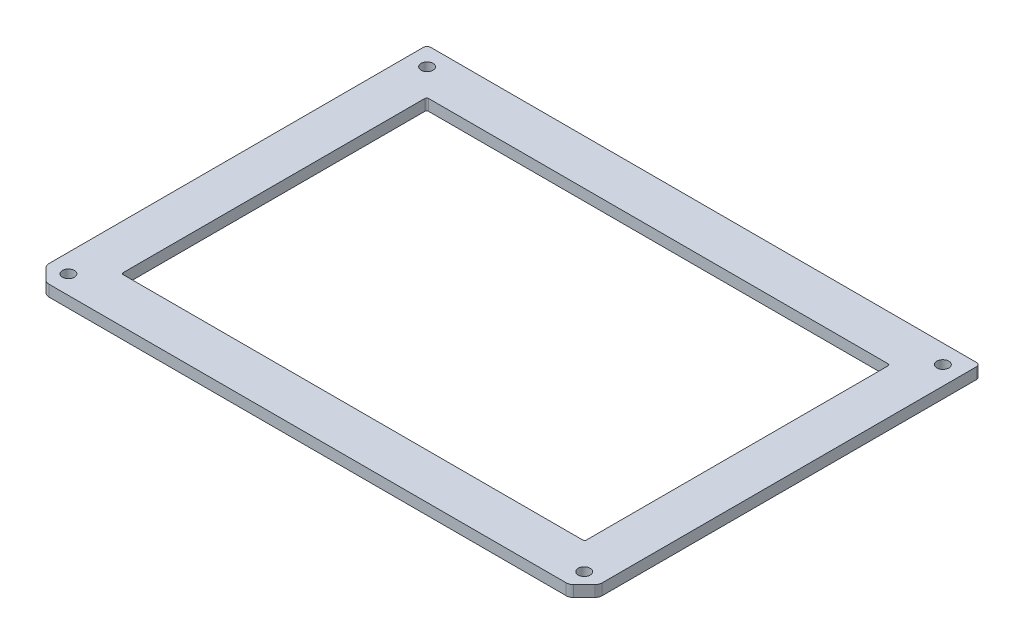
ISO-10303-21;
HEADER;
FILE_DESCRIPTION(('STEP AP214'),'2;1');
FILE_NAME('part.step','',(''),(''),'','','');
FILE_SCHEMA(('AUTOMOTIVE_DESIGN { 1 0 10303 214 1 1 1 1 }'));
ENDSEC;
DATA;
#1=APPLICATION_CONTEXT('core data for automotive mechanical design processes');
#2=APPLICATION_PROTOCOL_DEFINITION('international standard','automotive_design',2000,#1);
#3=PRODUCT_CONTEXT('',#1,'mechanical');
#4=PRODUCT('Part','Part','',(#3));
#5=PRODUCT_RELATED_PRODUCT_CATEGORY('part','',(#4));
#6=PRODUCT_DEFINITION_FORMATION('','',#4);
#7=PRODUCT_DEFINITION_CONTEXT('part definition',#1,'design');
#8=PRODUCT_DEFINITION('design','',#6,#7);
#9=PRODUCT_DEFINITION_SHAPE('','',#8);
#10=(LENGTH_UNIT() NAMED_UNIT(*) SI_UNIT(.MILLI.,.METRE.));
#11=(NAMED_UNIT(*) PLANE_ANGLE_UNIT() SI_UNIT($,.RADIAN.));
#12=(NAMED_UNIT(*) SI_UNIT($,.STERADIAN.) SOLID_ANGLE_UNIT());
#13=UNCERTAINTY_MEASURE_WITH_UNIT(LENGTH_MEASURE(1.E-05),#10,'distance_accuracy_value','');
#14=(GEOMETRIC_REPRESENTATION_CONTEXT(3) GLOBAL_UNCERTAINTY_ASSIGNED_CONTEXT((#13)) GLOBAL_UNIT_ASSIGNED_CONTEXT((#10,
#11,#12)) REPRESENTATION_CONTEXT('',''));
#15=CARTESIAN_POINT('',(0.,0.,0.));
#16=DIRECTION('',(0.,0.,1.));
#17=DIRECTION('',(1.,0.,0.));
#18=AXIS2_PLACEMENT_3D('',#15,#16,#17);
#19=CARTESIAN_POINT('',(0.,3.,0.));
#20=DIRECTION('',(0.,1.,0.));
#21=DIRECTION('',(0.,0.,1.));
#22=AXIS2_PLACEMENT_3D('',#19,#20,#21);
#23=PLANE('',#22);
#24=DIRECTION('',(-0.707106781186552,0.,0.707106781186543));
#25=VECTOR('',#24,1.);
#26=CARTESIAN_POINT('',(77.1,3.,46.05));
#27=LINE('',#26,#25);
#28=CARTESIAN_POINT('',(73.5142135623731,3.,49.6357864376269));
#29=VERTEX_POINT('',#28);
#30=CARTESIAN_POINT('',(70.6857864376268,3.,52.4642135623731));
#31=VERTEX_POINT('',#30);
#32=EDGE_CURVE('E298',#29,#31,#27,.T.);
#33=ORIENTED_EDGE('',*,*,#32,.F.);
#34=CARTESIAN_POINT('',(72.1,3.,48.2215728752538));
#35=DIRECTION('',(0.,1.,0.));
#36=DIRECTION('',(0.,0.,1.));
#37=AXIS2_PLACEMENT_3D('',#34,#35,#36);
#38=CIRCLE('',#37,2.);
#39=CARTESIAN_POINT('',(74.1,3.,48.2215728752538));
#40=VERTEX_POINT('',#39);
#41=EDGE_CURVE('E261',#29,#40,#38,.T.);
#42=ORIENTED_EDGE('',*,*,#41,.T.);
#43=DIRECTION('',(0.,0.,-1.));
#44=VECTOR('',#43,1.);
#45=CARTESIAN_POINT('',(74.1,3.,-53.05));
#46=LINE('',#45,#44);
#47=CARTESIAN_POINT('',(74.1,3.,-52.05));
#48=VERTEX_POINT('',#47);
#49=EDGE_CURVE('E200',#40,#48,#46,.T.);
#50=ORIENTED_EDGE('',*,*,#49,.T.);
#51=CARTESIAN_POINT('',(73.1,3.,-52.05));
#52=DIRECTION('',(0.,1.,0.));
#53=DIRECTION('',(0.,0.,1.));
#54=AXIS2_PLACEMENT_3D('',#51,#52,#53);
#55=CIRCLE('',#54,1.);
#56=CARTESIAN_POINT('',(73.1,3.,-53.05));
#57=VERTEX_POINT('',#56);
#58=EDGE_CURVE('E195',#48,#57,#55,.T.);
#59=ORIENTED_EDGE('',*,*,#58,.T.);
#60=DIRECTION('',(-1.,0.,0.));
#61=VECTOR('',#60,1.);
#62=CARTESIAN_POINT('',(-74.1,3.,-53.05));
#63=LINE('',#62,#61);
#64=CARTESIAN_POINT('',(-73.1,3.,-53.05));
#65=VERTEX_POINT('',#64);
#66=EDGE_CURVE('E196',#57,#65,#63,.T.);
#67=ORIENTED_EDGE('',*,*,#66,.T.);
#68=CARTESIAN_POINT('',(-73.1,3.,-52.05));
#69=DIRECTION('',(0.,1.,0.));
#70=DIRECTION('',(0.,0.,1.));
#71=AXIS2_PLACEMENT_3D('',#68,#69,#70);
#72=CIRCLE('',#71,1.);
#73=CARTESIAN_POINT('',(-74.1,3.,-52.05));
#74=VERTEX_POINT('',#73);
#75=EDGE_CURVE('E191',#65,#74,#72,.T.);
#76=ORIENTED_EDGE('',*,*,#75,.T.);
#77=DIRECTION('',(0.,0.,1.));
#78=VECTOR('',#77,1.);
#79=CARTESIAN_POINT('',(-74.1,3.,-53.05));
#80=LINE('',#79,#78);
#81=CARTESIAN_POINT('',(-74.1,3.,48.2215728752538));
#82=VERTEX_POINT('',#81);
#83=EDGE_CURVE('E350',#74,#82,#80,.T.);
#84=ORIENTED_EDGE('',*,*,#83,.T.);
#85=CARTESIAN_POINT('',(-72.1,3.,48.2215728752538));
#86=DIRECTION('',(0.,1.,0.));
#87=DIRECTION('',(0.,0.,1.));
#88=AXIS2_PLACEMENT_3D('',#85,#86,#87);
#89=CIRCLE('',#88,2.);
#90=CARTESIAN_POINT('',(-73.5142135623731,3.,49.6357864376269));
#91=VERTEX_POINT('',#90);
#92=EDGE_CURVE('E255',#82,#91,#89,.T.);
#93=ORIENTED_EDGE('',*,*,#92,.T.);
#94=DIRECTION('',(-0.707106781186551,0.,-0.707106781186544));
#95=VECTOR('',#94,1.);
#96=CARTESIAN_POINT('',(-77.1,3.,46.05));
#97=LINE('',#96,#95);
#98=CARTESIAN_POINT('',(-70.6857864376268,3.,52.4642135623731));
#99=VERTEX_POINT('',#98);
#100=EDGE_CURVE('E282',#99,#91,#97,.T.);
#101=ORIENTED_EDGE('',*,*,#100,.F.);
#102=CARTESIAN_POINT('',(-69.2715728752538,3.,51.05));
#103=DIRECTION('',(0.,1.,0.));
#104=DIRECTION('',(0.,0.,1.));
#105=AXIS2_PLACEMENT_3D('',#102,#103,#104);
#106=CIRCLE('',#105,2.);
#107=CARTESIAN_POINT('',(-69.2715728752538,3.,53.05));
#108=VERTEX_POINT('',#107);
#109=EDGE_CURVE('E257',#99,#108,#106,.T.);
#110=ORIENTED_EDGE('',*,*,#109,.T.);
#111=DIRECTION('',(1.,0.,0.));
#112=VECTOR('',#111,1.);
#113=CARTESIAN_POINT('',(-74.1,3.,53.05));
#114=LINE('',#113,#112);
#115=CARTESIAN_POINT('',(69.2715728752537,3.,53.05));
#116=VERTEX_POINT('',#115);
#117=EDGE_CURVE('E352',#108,#116,#114,.T.);
#118=ORIENTED_EDGE('',*,*,#117,.T.);
#119=CARTESIAN_POINT('',(69.2715728752537,3.,51.05));
#120=DIRECTION('',(0.,1.,0.));
#121=DIRECTION('',(0.,0.,1.));
#122=AXIS2_PLACEMENT_3D('',#119,#120,#121);
#123=CIRCLE('',#122,2.);
#124=EDGE_CURVE('E259',#116,#31,#123,.T.);
#125=ORIENTED_EDGE('',*,*,#124,.T.);
#126=EDGE_LOOP('',(#33,#42,#50,#59,#67,#76,#84,#93,#101,#110,#118,#125));
#127=FACE_BOUND('',#126,.T.);
#128=CARTESIAN_POINT('',(69.1,3.,48.05));
#129=DIRECTION('',(0.,1.,0.));
#130=DIRECTION('',(0.,0.,1.));
#131=AXIS2_PLACEMENT_3D('',#128,#129,#130);
#132=CIRCLE('',#131,1.60000000000001);
#133=CARTESIAN_POINT('',(69.1,3.,49.65));
#134=VERTEX_POINT('',#133);
#135=EDGE_CURVE('E308',#134,#134,#132,.T.);
#136=ORIENTED_EDGE('',*,*,#135,.F.);
#137=EDGE_LOOP('',(#136));
#138=FACE_BOUND('',#137,.T.);
#139=CARTESIAN_POINT('',(-69.1,3.,-48.05));
#140=DIRECTION('',(0.,1.,0.));
#141=DIRECTION('',(0.,0.,1.));
#142=AXIS2_PLACEMENT_3D('',#139,#140,#141);
#143=CIRCLE('',#142,1.60000000000001);
#144=CARTESIAN_POINT('',(-69.1,3.,-46.45));
#145=VERTEX_POINT('',#144);
#146=EDGE_CURVE('E320',#145,#145,#143,.T.);
#147=ORIENTED_EDGE('',*,*,#146,.F.);
#148=EDGE_LOOP('',(#147));
#149=FACE_BOUND('',#148,.T.);
#150=DIRECTION('',(-1.,0.,0.));
#151=VECTOR('',#150,1.);
#152=CARTESIAN_POINT('',(-62.05,3.,-40.9));
#153=LINE('',#152,#151);
#154=CARTESIAN_POINT('',(61.55,3.,-40.9));
#155=VERTEX_POINT('',#154);
#156=CARTESIAN_POINT('',(-61.55,3.,-40.9));
#157=VERTEX_POINT('',#156);
#158=EDGE_CURVE('E329',#155,#157,#153,.T.);
#159=ORIENTED_EDGE('',*,*,#158,.F.);
#160=CARTESIAN_POINT('',(61.55,3.,-40.4));
#161=DIRECTION('',(0.,1.,0.));
#162=DIRECTION('',(0.,0.,1.));
#163=AXIS2_PLACEMENT_3D('',#160,#161,#162);
#164=CIRCLE('',#163,0.5);
#165=CARTESIAN_POINT('',(62.05,3.,-40.4));
#166=VERTEX_POINT('',#165);
#167=EDGE_CURVE('E239',#155,#166,#164,.F.);
#168=ORIENTED_EDGE('',*,*,#167,.T.);
#169=DIRECTION('',(0.,0.,-1.));
#170=VECTOR('',#169,1.);
#171=CARTESIAN_POINT('',(62.05,3.,-40.9));
#172=LINE('',#171,#170);
#173=CARTESIAN_POINT('',(62.05,3.,40.4));
#174=VERTEX_POINT('',#173);
#175=EDGE_CURVE('E326',#174,#166,#172,.T.);
#176=ORIENTED_EDGE('',*,*,#175,.F.);
#177=CARTESIAN_POINT('',(61.55,3.,40.4));
#178=DIRECTION('',(0.,1.,0.));
#179=DIRECTION('',(0.,0.,1.));
#180=AXIS2_PLACEMENT_3D('',#177,#178,#179);
#181=CIRCLE('',#180,0.5);
#182=CARTESIAN_POINT('',(61.55,3.,40.9));
#183=VERTEX_POINT('',#182);
#184=EDGE_CURVE('E235',#174,#183,#181,.F.);
#185=ORIENTED_EDGE('',*,*,#184,.T.);
#186=DIRECTION('',(1.,0.,0.));
#187=VECTOR('',#186,1.);
#188=CARTESIAN_POINT('',(-62.05,3.,40.9));
#189=LINE('',#188,#187);
#190=CARTESIAN_POINT('',(-61.55,3.,40.9));
#191=VERTEX_POINT('',#190);
#192=EDGE_CURVE('E336',#191,#183,#189,.T.);
#193=ORIENTED_EDGE('',*,*,#192,.F.);
#194=CARTESIAN_POINT('',(-61.55,3.,40.4));
#195=DIRECTION('',(0.,1.,0.));
#196=DIRECTION('',(0.,0.,1.));
#197=AXIS2_PLACEMENT_3D('',#194,#195,#196);
#198=CIRCLE('',#197,0.5);
#199=CARTESIAN_POINT('',(-62.05,3.,40.4));
#200=VERTEX_POINT('',#199);
#201=EDGE_CURVE('E247',#191,#200,#198,.F.);
#202=ORIENTED_EDGE('',*,*,#201,.T.);
#203=DIRECTION('',(0.,0.,1.));
#204=VECTOR('',#203,1.);
#205=CARTESIAN_POINT('',(-62.05,3.,-40.9));
#206=LINE('',#205,#204);
#207=CARTESIAN_POINT('',(-62.05,3.,-40.4));
#208=VERTEX_POINT('',#207);
#209=EDGE_CURVE('E333',#208,#200,#206,.T.);
#210=ORIENTED_EDGE('',*,*,#209,.F.);
#211=CARTESIAN_POINT('',(-61.55,3.,-40.4));
#212=DIRECTION('',(0.,1.,0.));
#213=DIRECTION('',(0.,0.,1.));
#214=AXIS2_PLACEMENT_3D('',#211,#212,#213);
#215=CIRCLE('',#214,0.5);
#216=EDGE_CURVE('E243',#208,#157,#215,.F.);
#217=ORIENTED_EDGE('',*,*,#216,.T.);
#218=EDGE_LOOP('',(#159,#168,#176,#185,#193,#202,#210,#217));
#219=FACE_BOUND('',#218,.T.);
#220=CARTESIAN_POINT('',(-69.1,3.,48.05));
#221=DIRECTION('',(0.,1.,0.));
#222=DIRECTION('',(0.,0.,-1.));
#223=AXIS2_PLACEMENT_3D('',#220,#221,#222);
#224=CIRCLE('',#223,1.60000000000001);
#225=CARTESIAN_POINT('',(-69.1,3.,46.45));
#226=VERTEX_POINT('',#225);
#227=EDGE_CURVE('E314',#226,#226,#224,.T.);
#228=ORIENTED_EDGE('',*,*,#227,.F.);
#229=EDGE_LOOP('',(#228));
#230=FACE_BOUND('',#229,.T.);
#231=CARTESIAN_POINT('',(69.1,3.,-48.05));
#232=DIRECTION('',(0.,1.,0.));
#233=DIRECTION('',(0.,0.,-1.));
#234=AXIS2_PLACEMENT_3D('',#231,#232,#233);
#235=CIRCLE('',#234,1.60000000000001);
#236=CARTESIAN_POINT('',(69.1,3.,-49.65));
#237=VERTEX_POINT('',#236);
#238=EDGE_CURVE('E302',#237,#237,#235,.T.);
#239=ORIENTED_EDGE('',*,*,#238,.F.);
#240=EDGE_LOOP('',(#239));
#241=FACE_BOUND('',#240,.T.);
#242=ADVANCED_FACE('F33',(#127,#138,#149,#219,#230,#241),#23,.T.);
#243=CARTESIAN_POINT('',(0.,0.,0.));
#244=DIRECTION('',(0.,1.,0.));
#245=DIRECTION('',(0.,0.,1.));
#246=AXIS2_PLACEMENT_3D('',#243,#244,#245);
#247=PLANE('',#246);
#248=DIRECTION('',(0.,0.,-1.));
#249=VECTOR('',#248,1.);
#250=CARTESIAN_POINT('',(74.1,0.,-53.05));
#251=LINE('',#250,#249);
#252=CARTESIAN_POINT('',(74.1,0.,48.2215728752538));
#253=VERTEX_POINT('',#252);
#254=CARTESIAN_POINT('',(74.1,0.,-52.05));
#255=VERTEX_POINT('',#254);
#256=EDGE_CURVE('E170',#253,#255,#251,.T.);
#257=ORIENTED_EDGE('',*,*,#256,.F.);
#258=CARTESIAN_POINT('',(72.1,0.,48.2215728752538));
#259=DIRECTION('',(0.,1.,0.));
#260=DIRECTION('',(0.,0.,1.));
#261=AXIS2_PLACEMENT_3D('',#258,#259,#260);
#262=CIRCLE('',#261,2.);
#263=CARTESIAN_POINT('',(73.5142135623731,0.,49.6357864376269));
#264=VERTEX_POINT('',#263);
#265=EDGE_CURVE('E268',#253,#264,#262,.F.);
#266=ORIENTED_EDGE('',*,*,#265,.T.);
#267=DIRECTION('',(0.707106781186552,0.,-0.707106781186543));
#268=VECTOR('',#267,1.);
#269=CARTESIAN_POINT('',(77.1,0.,46.05));
#270=LINE('',#269,#268);
#271=CARTESIAN_POINT('',(70.6857864376268,0.,52.4642135623731));
#272=VERTEX_POINT('',#271);
#273=EDGE_CURVE('E293',#272,#264,#270,.T.);
#274=ORIENTED_EDGE('',*,*,#273,.F.);
#275=CARTESIAN_POINT('',(69.2715728752537,0.,51.05));
#276=DIRECTION('',(0.,1.,0.));
#277=DIRECTION('',(0.,0.,1.));
#278=AXIS2_PLACEMENT_3D('',#275,#276,#277);
#279=CIRCLE('',#278,2.);
#280=CARTESIAN_POINT('',(69.2715728752537,0.,53.05));
#281=VERTEX_POINT('',#280);
#282=EDGE_CURVE('E266',#272,#281,#279,.F.);
#283=ORIENTED_EDGE('',*,*,#282,.T.);
#284=DIRECTION('',(1.,0.,0.));
#285=VECTOR('',#284,1.);
#286=CARTESIAN_POINT('',(-74.1,0.,53.05));
#287=LINE('',#286,#285);
#288=CARTESIAN_POINT('',(-69.2715728752538,0.,53.05));
#289=VERTEX_POINT('',#288);
#290=EDGE_CURVE('E181',#289,#281,#287,.T.);
#291=ORIENTED_EDGE('',*,*,#290,.F.);
#292=CARTESIAN_POINT('',(-69.2715728752538,0.,51.05));
#293=DIRECTION('',(0.,1.,0.));
#294=DIRECTION('',(0.,0.,1.));
#295=AXIS2_PLACEMENT_3D('',#292,#293,#294);
#296=CIRCLE('',#295,2.);
#297=CARTESIAN_POINT('',(-70.6857864376268,0.,52.4642135623731));
#298=VERTEX_POINT('',#297);
#299=EDGE_CURVE('E54',#289,#298,#296,.F.);
#300=ORIENTED_EDGE('',*,*,#299,.T.);
#301=DIRECTION('',(0.707106781186551,0.,0.707106781186544));
#302=VECTOR('',#301,1.);
#303=CARTESIAN_POINT('',(-77.1,0.,46.05));
#304=LINE('',#303,#302);
#305=CARTESIAN_POINT('',(-73.5142135623731,0.,49.6357864376269));
#306=VERTEX_POINT('',#305);
#307=EDGE_CURVE('E284',#306,#298,#304,.T.);
#308=ORIENTED_EDGE('',*,*,#307,.F.);
#309=CARTESIAN_POINT('',(-72.1,0.,48.2215728752538));
#310=DIRECTION('',(0.,1.,0.));
#311=DIRECTION('',(0.,0.,1.));
#312=AXIS2_PLACEMENT_3D('',#309,#310,#311);
#313=CIRCLE('',#312,2.);
#314=CARTESIAN_POINT('',(-74.1,0.,48.2215728752538));
#315=VERTEX_POINT('',#314);
#316=EDGE_CURVE('E48',#306,#315,#313,.F.);
#317=ORIENTED_EDGE('',*,*,#316,.T.);
#318=DIRECTION('',(0.,0.,1.));
#319=VECTOR('',#318,1.);
#320=CARTESIAN_POINT('',(-74.1,0.,-53.05));
#321=LINE('',#320,#319);
#322=CARTESIAN_POINT('',(-74.1,0.,-52.05));
#323=VERTEX_POINT('',#322);
#324=EDGE_CURVE('E339',#323,#315,#321,.T.);
#325=ORIENTED_EDGE('',*,*,#324,.F.);
#326=CARTESIAN_POINT('',(-73.1,0.,-52.05));
#327=DIRECTION('',(0.,1.,0.));
#328=DIRECTION('',(0.,0.,1.));
#329=AXIS2_PLACEMENT_3D('',#326,#327,#328);
#330=CIRCLE('',#329,1.);
#331=CARTESIAN_POINT('',(-73.1,0.,-53.05));
#332=VERTEX_POINT('',#331);
#333=EDGE_CURVE('E192',#323,#332,#330,.F.);
#334=ORIENTED_EDGE('',*,*,#333,.T.);
#335=DIRECTION('',(-1.,0.,0.));
#336=VECTOR('',#335,1.);
#337=CARTESIAN_POINT('',(-74.1,0.,-53.05));
#338=LINE('',#337,#336);
#339=CARTESIAN_POINT('',(73.1,0.,-53.05));
#340=VERTEX_POINT('',#339);
#341=EDGE_CURVE('E180',#340,#332,#338,.T.);
#342=ORIENTED_EDGE('',*,*,#341,.F.);
#343=CARTESIAN_POINT('',(73.1,0.,-52.05));
#344=DIRECTION('',(0.,1.,0.));
#345=DIRECTION('',(0.,0.,1.));
#346=AXIS2_PLACEMENT_3D('',#343,#344,#345);
#347=CIRCLE('',#346,1.);
#348=EDGE_CURVE('E184',#340,#255,#347,.F.);
#349=ORIENTED_EDGE('',*,*,#348,.T.);
#350=EDGE_LOOP('',(#257,#266,#274,#283,#291,#300,#308,#317,#325,#334,#342,#349));
#351=FACE_BOUND('',#350,.T.);
#352=DIRECTION('',(1.,0.,0.));
#353=VECTOR('',#352,1.);
#354=CARTESIAN_POINT('',(-62.05,0.,40.9));
#355=LINE('',#354,#353);
#356=CARTESIAN_POINT('',(-61.55,0.,40.9));
#357=VERTEX_POINT('',#356);
#358=CARTESIAN_POINT('',(61.55,0.,40.9));
#359=VERTEX_POINT('',#358);
#360=EDGE_CURVE('E330',#357,#359,#355,.T.);
#361=ORIENTED_EDGE('',*,*,#360,.T.);
#362=CARTESIAN_POINT('',(61.55,0.,40.4));
#363=DIRECTION('',(0.,1.,0.));
#364=DIRECTION('',(0.,0.,1.));
#365=AXIS2_PLACEMENT_3D('',#362,#363,#364);
#366=CIRCLE('',#365,0.5);
#367=CARTESIAN_POINT('',(62.05,0.,40.4));
#368=VERTEX_POINT('',#367);
#369=EDGE_CURVE('E233',#359,#368,#366,.T.);
#370=ORIENTED_EDGE('',*,*,#369,.T.);
#371=DIRECTION('',(0.,0.,-1.));
#372=VECTOR('',#371,1.);
#373=CARTESIAN_POINT('',(62.05,0.,-40.9));
#374=LINE('',#373,#372);
#375=CARTESIAN_POINT('',(62.05,0.,-40.4));
#376=VERTEX_POINT('',#375);
#377=EDGE_CURVE('E323',#368,#376,#374,.T.);
#378=ORIENTED_EDGE('',*,*,#377,.T.);
#379=CARTESIAN_POINT('',(61.55,0.,-40.4));
#380=DIRECTION('',(0.,1.,0.));
#381=DIRECTION('',(0.,0.,1.));
#382=AXIS2_PLACEMENT_3D('',#379,#380,#381);
#383=CIRCLE('',#382,0.5);
#384=CARTESIAN_POINT('',(61.55,0.,-40.9));
#385=VERTEX_POINT('',#384);
#386=EDGE_CURVE('E237',#376,#385,#383,.T.);
#387=ORIENTED_EDGE('',*,*,#386,.T.);
#388=DIRECTION('',(-1.,0.,0.));
#389=VECTOR('',#388,1.);
#390=CARTESIAN_POINT('',(-62.05,0.,-40.9));
#391=LINE('',#390,#389);
#392=CARTESIAN_POINT('',(-61.55,0.,-40.9));
#393=VERTEX_POINT('',#392);
#394=EDGE_CURVE('E342',#385,#393,#391,.T.);
#395=ORIENTED_EDGE('',*,*,#394,.T.);
#396=CARTESIAN_POINT('',(-61.55,0.,-40.4));
#397=DIRECTION('',(0.,1.,0.));
#398=DIRECTION('',(0.,0.,1.));
#399=AXIS2_PLACEMENT_3D('',#396,#397,#398);
#400=CIRCLE('',#399,0.5);
#401=CARTESIAN_POINT('',(-62.05,0.,-40.4));
#402=VERTEX_POINT('',#401);
#403=EDGE_CURVE('E241',#393,#402,#400,.T.);
#404=ORIENTED_EDGE('',*,*,#403,.T.);
#405=DIRECTION('',(0.,0.,1.));
#406=VECTOR('',#405,1.);
#407=CARTESIAN_POINT('',(-62.05,0.,-40.9));
#408=LINE('',#407,#406);
#409=CARTESIAN_POINT('',(-62.05,0.,40.4));
#410=VERTEX_POINT('',#409);
#411=EDGE_CURVE('E345',#402,#410,#408,.T.);
#412=ORIENTED_EDGE('',*,*,#411,.T.);
#413=CARTESIAN_POINT('',(-61.55,0.,40.4));
#414=DIRECTION('',(0.,1.,0.));
#415=DIRECTION('',(0.,0.,1.));
#416=AXIS2_PLACEMENT_3D('',#413,#414,#415);
#417=CIRCLE('',#416,0.5);
#418=EDGE_CURVE('E245',#410,#357,#417,.T.);
#419=ORIENTED_EDGE('',*,*,#418,.T.);
#420=EDGE_LOOP('',(#361,#370,#378,#387,#395,#404,#412,#419));
#421=FACE_BOUND('',#420,.T.);
#422=CARTESIAN_POINT('',(-69.1,0.,-48.05));
#423=DIRECTION('',(0.,1.,0.));
#424=DIRECTION('',(0.,0.,1.));
#425=AXIS2_PLACEMENT_3D('',#422,#423,#424);
#426=CIRCLE('',#425,1.60000000000001);
#427=CARTESIAN_POINT('',(-69.1,0.,-46.45));
#428=VERTEX_POINT('',#427);
#429=EDGE_CURVE('E317',#428,#428,#426,.T.);
#430=ORIENTED_EDGE('',*,*,#429,.T.);
#431=EDGE_LOOP('',(#430));
#432=FACE_BOUND('',#431,.T.);
#433=CARTESIAN_POINT('',(-69.1,0.,48.05));
#434=DIRECTION('',(0.,1.,0.));
#435=DIRECTION('',(0.,0.,-1.));
#436=AXIS2_PLACEMENT_3D('',#433,#434,#435);
#437=CIRCLE('',#436,1.60000000000001);
#438=CARTESIAN_POINT('',(-69.1,0.,46.45));
#439=VERTEX_POINT('',#438);
#440=EDGE_CURVE('E311',#439,#439,#437,.T.);
#441=ORIENTED_EDGE('',*,*,#440,.T.);
#442=EDGE_LOOP('',(#441));
#443=FACE_BOUND('',#442,.T.);
#444=CARTESIAN_POINT('',(69.1,0.,48.05));
#445=DIRECTION('',(0.,1.,0.));
#446=DIRECTION('',(0.,0.,1.));
#447=AXIS2_PLACEMENT_3D('',#444,#445,#446);
#448=CIRCLE('',#447,1.60000000000001);
#449=CARTESIAN_POINT('',(69.1,0.,49.65));
#450=VERTEX_POINT('',#449);
#451=EDGE_CURVE('E305',#450,#450,#448,.T.);
#452=ORIENTED_EDGE('',*,*,#451,.T.);
#453=EDGE_LOOP('',(#452));
#454=FACE_BOUND('',#453,.T.);
#455=CARTESIAN_POINT('',(69.1,0.,-48.05));
#456=DIRECTION('',(0.,1.,0.));
#457=DIRECTION('',(0.,0.,-1.));
#458=AXIS2_PLACEMENT_3D('',#455,#456,#457);
#459=CIRCLE('',#458,1.60000000000001);
#460=CARTESIAN_POINT('',(69.1,0.,-49.65));
#461=VERTEX_POINT('',#460);
#462=EDGE_CURVE('E295',#461,#461,#459,.T.);
#463=ORIENTED_EDGE('',*,*,#462,.T.);
#464=EDGE_LOOP('',(#463));
#465=FACE_BOUND('',#464,.T.);
#466=ADVANCED_FACE('F185',(#351,#421,#432,#443,#454,#465),#247,.F.);
#467=CARTESIAN_POINT('',(-74.1,3.,-53.05));
#468=DIRECTION('',(1.,0.,0.));
#469=DIRECTION('',(0.,0.,-1.));
#470=AXIS2_PLACEMENT_3D('',#467,#468,#469);
#471=PLANE('',#470);
#472=ORIENTED_EDGE('',*,*,#324,.T.);
#473=DIRECTION('',(0.,-1.,0.));
#474=VECTOR('',#473,1.);
#475=CARTESIAN_POINT('',(-74.1,3.,48.2215728752538));
#476=LINE('',#475,#474);
#477=EDGE_CURVE('E11',#315,#82,#476,.F.);
#478=ORIENTED_EDGE('',*,*,#477,.T.);
#479=ORIENTED_EDGE('',*,*,#83,.F.);
#480=DIRECTION('',(0.,-1.,0.));
#481=VECTOR('',#480,1.);
#482=CARTESIAN_POINT('',(-74.1,3.,-52.05));
#483=LINE('',#482,#481);
#484=EDGE_CURVE('E210',#74,#323,#483,.T.);
#485=ORIENTED_EDGE('',*,*,#484,.T.);
#486=EDGE_LOOP('',(#472,#478,#479,#485));
#487=FACE_BOUND('',#486,.T.);
#488=ADVANCED_FACE('F382',(#487),#471,.F.);
#489=CARTESIAN_POINT('',(-74.1,3.,53.05));
#490=DIRECTION('',(0.,0.,-1.));
#491=DIRECTION('',(-1.,0.,0.));
#492=AXIS2_PLACEMENT_3D('',#489,#490,#491);
#493=PLANE('',#492);
#494=ORIENTED_EDGE('',*,*,#290,.T.);
#495=DIRECTION('',(0.,-1.,0.));
#496=VECTOR('',#495,1.);
#497=CARTESIAN_POINT('',(69.2715728752537,3.,53.05));
#498=LINE('',#497,#496);
#499=EDGE_CURVE('E272',#281,#116,#498,.F.);
#500=ORIENTED_EDGE('',*,*,#499,.T.);
#501=ORIENTED_EDGE('',*,*,#117,.F.);
#502=DIRECTION('',(0.,1.,0.));
#503=VECTOR('',#502,1.);
#504=CARTESIAN_POINT('',(-69.2715728752538,3.,53.05));
#505=LINE('',#504,#503);
#506=EDGE_CURVE('E270',#108,#289,#505,.F.);
#507=ORIENTED_EDGE('',*,*,#506,.T.);
#508=EDGE_LOOP('',(#494,#500,#501,#507));
#509=FACE_BOUND('',#508,.T.);
#510=ADVANCED_FACE('F359',(#509),#493,.F.);
#511=CARTESIAN_POINT('',(74.1,3.,-53.05));
#512=DIRECTION('',(-1.,0.,0.));
#513=DIRECTION('',(0.,0.,1.));
#514=AXIS2_PLACEMENT_3D('',#511,#512,#513);
#515=PLANE('',#514);
#516=ORIENTED_EDGE('',*,*,#49,.F.);
#517=DIRECTION('',(0.,1.,0.));
#518=VECTOR('',#517,1.);
#519=CARTESIAN_POINT('',(74.1,3.,48.2215728752538));
#520=LINE('',#519,#518);
#521=EDGE_CURVE('E178',#40,#253,#520,.F.);
#522=ORIENTED_EDGE('',*,*,#521,.T.);
#523=ORIENTED_EDGE('',*,*,#256,.T.);
#524=DIRECTION('',(0.,-1.,0.));
#525=VECTOR('',#524,1.);
#526=CARTESIAN_POINT('',(74.1,3.,-52.05));
#527=LINE('',#526,#525);
#528=EDGE_CURVE('E175',#255,#48,#527,.F.);
#529=ORIENTED_EDGE('',*,*,#528,.T.);
#530=EDGE_LOOP('',(#516,#522,#523,#529));
#531=FACE_BOUND('',#530,.T.);
#532=ADVANCED_FACE('F173',(#531),#515,.F.);
#533=CARTESIAN_POINT('',(-74.1,3.,-53.05));
#534=DIRECTION('',(0.,0.,1.));
#535=DIRECTION('',(1.,0.,0.));
#536=AXIS2_PLACEMENT_3D('',#533,#534,#535);
#537=PLANE('',#536);
#538=ORIENTED_EDGE('',*,*,#66,.F.);
#539=DIRECTION('',(0.,-1.,0.));
#540=VECTOR('',#539,1.);
#541=CARTESIAN_POINT('',(73.1,3.,-53.05));
#542=LINE('',#541,#540);
#543=EDGE_CURVE('E208',#57,#340,#542,.T.);
#544=ORIENTED_EDGE('',*,*,#543,.T.);
#545=ORIENTED_EDGE('',*,*,#341,.T.);
#546=DIRECTION('',(0.,-1.,0.));
#547=VECTOR('',#546,1.);
#548=CARTESIAN_POINT('',(-73.1,3.,-53.05));
#549=LINE('',#548,#547);
#550=EDGE_CURVE('E206',#332,#65,#549,.F.);
#551=ORIENTED_EDGE('',*,*,#550,.T.);
#552=EDGE_LOOP('',(#538,#544,#545,#551));
#553=FACE_BOUND('',#552,.T.);
#554=ADVANCED_FACE('F375',(#553),#537,.F.);
#555=CARTESIAN_POINT('',(62.05,3.,-40.9));
#556=DIRECTION('',(-1.,0.,0.));
#557=DIRECTION('',(0.,0.,1.));
#558=AXIS2_PLACEMENT_3D('',#555,#556,#557);
#559=PLANE('',#558);
#560=ORIENTED_EDGE('',*,*,#377,.F.);
#561=DIRECTION('',(0.,-1.,0.));
#562=VECTOR('',#561,1.);
#563=CARTESIAN_POINT('',(62.05,3.,40.4));
#564=LINE('',#563,#562);
#565=EDGE_CURVE('E221',#368,#174,#564,.F.);
#566=ORIENTED_EDGE('',*,*,#565,.T.);
#567=ORIENTED_EDGE('',*,*,#175,.T.);
#568=DIRECTION('',(0.,-1.,0.));
#569=VECTOR('',#568,1.);
#570=CARTESIAN_POINT('',(62.05,0.,-40.4));
#571=LINE('',#570,#569);
#572=EDGE_CURVE('E218',#166,#376,#571,.T.);
#573=ORIENTED_EDGE('',*,*,#572,.T.);
#574=EDGE_LOOP('',(#560,#566,#567,#573));
#575=FACE_BOUND('',#574,.T.);
#576=ADVANCED_FACE('F397',(#575),#559,.T.);
#577=CARTESIAN_POINT('',(-62.05,3.,-40.9));
#578=DIRECTION('',(0.,0.,1.));
#579=DIRECTION('',(1.,0.,0.));
#580=AXIS2_PLACEMENT_3D('',#577,#578,#579);
#581=PLANE('',#580);
#582=ORIENTED_EDGE('',*,*,#394,.F.);
#583=DIRECTION('',(0.,-1.,0.));
#584=VECTOR('',#583,1.);
#585=CARTESIAN_POINT('',(61.55,3.,-40.9));
#586=LINE('',#585,#584);
#587=EDGE_CURVE('E226',#385,#155,#586,.F.);
#588=ORIENTED_EDGE('',*,*,#587,.T.);
#589=ORIENTED_EDGE('',*,*,#158,.T.);
#590=DIRECTION('',(0.,-1.,0.));
#591=VECTOR('',#590,1.);
#592=CARTESIAN_POINT('',(-61.55,0.,-40.9));
#593=LINE('',#592,#591);
#594=EDGE_CURVE('E223',#157,#393,#593,.T.);
#595=ORIENTED_EDGE('',*,*,#594,.T.);
#596=EDGE_LOOP('',(#582,#588,#589,#595));
#597=FACE_BOUND('',#596,.T.);
#598=ADVANCED_FACE('F552',(#597),#581,.T.);
#599=CARTESIAN_POINT('',(-62.05,3.,-40.9));
#600=DIRECTION('',(1.,0.,0.));
#601=DIRECTION('',(0.,0.,-1.));
#602=AXIS2_PLACEMENT_3D('',#599,#600,#601);
#603=PLANE('',#602);
#604=ORIENTED_EDGE('',*,*,#411,.F.);
#605=DIRECTION('',(0.,-1.,0.));
#606=VECTOR('',#605,1.);
#607=CARTESIAN_POINT('',(-62.05,3.,-40.4));
#608=LINE('',#607,#606);
#609=EDGE_CURVE('E231',#402,#208,#608,.F.);
#610=ORIENTED_EDGE('',*,*,#609,.T.);
#611=ORIENTED_EDGE('',*,*,#209,.T.);
#612=DIRECTION('',(0.,-1.,0.));
#613=VECTOR('',#612,1.);
#614=CARTESIAN_POINT('',(-62.05,0.,40.4));
#615=LINE('',#614,#613);
#616=EDGE_CURVE('E228',#200,#410,#615,.T.);
#617=ORIENTED_EDGE('',*,*,#616,.T.);
#618=EDGE_LOOP('',(#604,#610,#611,#617));
#619=FACE_BOUND('',#618,.T.);
#620=ADVANCED_FACE('F543',(#619),#603,.T.);
#621=CARTESIAN_POINT('',(-62.05,3.,40.9));
#622=DIRECTION('',(0.,0.,-1.));
#623=DIRECTION('',(-1.,0.,0.));
#624=AXIS2_PLACEMENT_3D('',#621,#622,#623);
#625=PLANE('',#624);
#626=ORIENTED_EDGE('',*,*,#192,.T.);
#627=DIRECTION('',(0.,-1.,0.));
#628=VECTOR('',#627,1.);
#629=CARTESIAN_POINT('',(61.55,0.,40.9));
#630=LINE('',#629,#628);
#631=EDGE_CURVE('E215',#183,#359,#630,.T.);
#632=ORIENTED_EDGE('',*,*,#631,.T.);
#633=ORIENTED_EDGE('',*,*,#360,.F.);
#634=DIRECTION('',(0.,-1.,0.));
#635=VECTOR('',#634,1.);
#636=CARTESIAN_POINT('',(-61.55,3.,40.9));
#637=LINE('',#636,#635);
#638=EDGE_CURVE('E213',#357,#191,#637,.F.);
#639=ORIENTED_EDGE('',*,*,#638,.T.);
#640=EDGE_LOOP('',(#626,#632,#633,#639));
#641=FACE_BOUND('',#640,.T.);
#642=ADVANCED_FACE('F535',(#641),#625,.T.);
#643=CARTESIAN_POINT('',(-69.1,3.,-48.05));
#644=DIRECTION('',(0.,-1.,0.));
#645=DIRECTION('',(0.,0.,-1.));
#646=AXIS2_PLACEMENT_3D('',#643,#644,#645);
#647=CYLINDRICAL_SURFACE('',#646,1.60000000000001);
#648=ORIENTED_EDGE('',*,*,#146,.T.);
#649=EDGE_LOOP('',(#648));
#650=FACE_BOUND('',#649,.T.);
#651=ORIENTED_EDGE('',*,*,#429,.F.);
#652=EDGE_LOOP('',(#651));
#653=FACE_BOUND('',#652,.T.);
#654=ADVANCED_FACE('F526',(#650,#653),#647,.F.);
#655=CARTESIAN_POINT('',(-69.1,3.,48.05));
#656=DIRECTION('',(0.,-1.,0.));
#657=DIRECTION('',(0.,0.,-1.));
#658=AXIS2_PLACEMENT_3D('',#655,#656,#657);
#659=CYLINDRICAL_SURFACE('',#658,1.60000000000001);
#660=ORIENTED_EDGE('',*,*,#227,.T.);
#661=EDGE_LOOP('',(#660));
#662=FACE_BOUND('',#661,.T.);
#663=ORIENTED_EDGE('',*,*,#440,.F.);
#664=EDGE_LOOP('',(#663));
#665=FACE_BOUND('',#664,.T.);
#666=ADVANCED_FACE('F517',(#662,#665),#659,.F.);
#667=CARTESIAN_POINT('',(69.1,3.,48.05));
#668=DIRECTION('',(0.,-1.,0.));
#669=DIRECTION('',(0.,0.,-1.));
#670=AXIS2_PLACEMENT_3D('',#667,#668,#669);
#671=CYLINDRICAL_SURFACE('',#670,1.60000000000001);
#672=ORIENTED_EDGE('',*,*,#135,.T.);
#673=EDGE_LOOP('',(#672));
#674=FACE_BOUND('',#673,.T.);
#675=ORIENTED_EDGE('',*,*,#451,.F.);
#676=EDGE_LOOP('',(#675));
#677=FACE_BOUND('',#676,.T.);
#678=ADVANCED_FACE('F508',(#674,#677),#671,.F.);
#679=CARTESIAN_POINT('',(69.1,3.,-48.05));
#680=DIRECTION('',(0.,-1.,0.));
#681=DIRECTION('',(0.,0.,-1.));
#682=AXIS2_PLACEMENT_3D('',#679,#680,#681);
#683=CYLINDRICAL_SURFACE('',#682,1.60000000000001);
#684=ORIENTED_EDGE('',*,*,#238,.T.);
#685=EDGE_LOOP('',(#684));
#686=FACE_BOUND('',#685,.T.);
#687=ORIENTED_EDGE('',*,*,#462,.F.);
#688=EDGE_LOOP('',(#687));
#689=FACE_BOUND('',#688,.T.);
#690=ADVANCED_FACE('F410',(#686,#689),#683,.F.);
#691=CARTESIAN_POINT('',(73.1,3.,-52.05));
#692=DIRECTION('',(0.,-1.,0.));
#693=DIRECTION('',(0.,0.,-1.));
#694=AXIS2_PLACEMENT_3D('',#691,#692,#693);
#695=CYLINDRICAL_SURFACE('',#694,1.);
#696=ORIENTED_EDGE('',*,*,#58,.F.);
#697=ORIENTED_EDGE('',*,*,#528,.F.);
#698=ORIENTED_EDGE('',*,*,#348,.F.);
#699=ORIENTED_EDGE('',*,*,#543,.F.);
#700=EDGE_LOOP('',(#696,#697,#698,#699));
#701=FACE_BOUND('',#700,.T.);
#702=ADVANCED_FACE('F194',(#701),#695,.T.);
#703=CARTESIAN_POINT('',(-73.1,3.,-52.05));
#704=DIRECTION('',(0.,-1.,0.));
#705=DIRECTION('',(0.,0.,-1.));
#706=AXIS2_PLACEMENT_3D('',#703,#704,#705);
#707=CYLINDRICAL_SURFACE('',#706,1.);
#708=ORIENTED_EDGE('',*,*,#75,.F.);
#709=ORIENTED_EDGE('',*,*,#550,.F.);
#710=ORIENTED_EDGE('',*,*,#333,.F.);
#711=ORIENTED_EDGE('',*,*,#484,.F.);
#712=EDGE_LOOP('',(#708,#709,#710,#711));
#713=FACE_BOUND('',#712,.T.);
#714=ADVANCED_FACE('F378',(#713),#707,.T.);
#715=CARTESIAN_POINT('',(61.55,3.,40.4));
#716=DIRECTION('',(0.,1.,0.));
#717=DIRECTION('',(0.,0.,1.));
#718=AXIS2_PLACEMENT_3D('',#715,#716,#717);
#719=CYLINDRICAL_SURFACE('',#718,0.5);
#720=ORIENTED_EDGE('',*,*,#184,.F.);
#721=ORIENTED_EDGE('',*,*,#565,.F.);
#722=ORIENTED_EDGE('',*,*,#369,.F.);
#723=ORIENTED_EDGE('',*,*,#631,.F.);
#724=EDGE_LOOP('',(#720,#721,#722,#723));
#725=FACE_BOUND('',#724,.T.);
#726=ADVANCED_FACE('F413',(#725),#719,.F.);
#727=CARTESIAN_POINT('',(61.55,3.,-40.4));
#728=DIRECTION('',(0.,1.,0.));
#729=DIRECTION('',(0.,0.,1.));
#730=AXIS2_PLACEMENT_3D('',#727,#728,#729);
#731=CYLINDRICAL_SURFACE('',#730,0.5);
#732=ORIENTED_EDGE('',*,*,#167,.F.);
#733=ORIENTED_EDGE('',*,*,#587,.F.);
#734=ORIENTED_EDGE('',*,*,#386,.F.);
#735=ORIENTED_EDGE('',*,*,#572,.F.);
#736=EDGE_LOOP('',(#732,#733,#734,#735));
#737=FACE_BOUND('',#736,.T.);
#738=ADVANCED_FACE('F416',(#737),#731,.F.);
#739=CARTESIAN_POINT('',(-61.55,3.,-40.4));
#740=DIRECTION('',(0.,1.,0.));
#741=DIRECTION('',(0.,0.,1.));
#742=AXIS2_PLACEMENT_3D('',#739,#740,#741);
#743=CYLINDRICAL_SURFACE('',#742,0.5);
#744=ORIENTED_EDGE('',*,*,#216,.F.);
#745=ORIENTED_EDGE('',*,*,#609,.F.);
#746=ORIENTED_EDGE('',*,*,#403,.F.);
#747=ORIENTED_EDGE('',*,*,#594,.F.);
#748=EDGE_LOOP('',(#744,#745,#746,#747));
#749=FACE_BOUND('',#748,.T.);
#750=ADVANCED_FACE('F420',(#749),#743,.F.);
#751=CARTESIAN_POINT('',(-61.55,3.,40.4));
#752=DIRECTION('',(0.,1.,0.));
#753=DIRECTION('',(0.,0.,1.));
#754=AXIS2_PLACEMENT_3D('',#751,#752,#753);
#755=CYLINDRICAL_SURFACE('',#754,0.5);
#756=ORIENTED_EDGE('',*,*,#201,.F.);
#757=ORIENTED_EDGE('',*,*,#638,.F.);
#758=ORIENTED_EDGE('',*,*,#418,.F.);
#759=ORIENTED_EDGE('',*,*,#616,.F.);
#760=EDGE_LOOP('',(#756,#757,#758,#759));
#761=FACE_BOUND('',#760,.T.);
#762=ADVANCED_FACE('F424',(#761),#755,.F.);
#763=CARTESIAN_POINT('',(-77.1,-0.00100000000000013,46.05));
#764=DIRECTION('',(0.707106781186544,0.,-0.707106781186551));
#765=DIRECTION('',(-0.707106781186551,0.,-0.707106781186544));
#766=AXIS2_PLACEMENT_3D('',#763,#764,#765);
#767=PLANE('',#766);
#768=ORIENTED_EDGE('',*,*,#307,.T.);
#769=DIRECTION('',(0.,1.,0.));
#770=VECTOR('',#769,1.);
#771=CARTESIAN_POINT('',(-70.6857864376268,-0.00100000000000013,52.4642135623731));
#772=LINE('',#771,#770);
#773=EDGE_CURVE('E41',#298,#99,#772,.T.);
#774=ORIENTED_EDGE('',*,*,#773,.T.);
#775=ORIENTED_EDGE('',*,*,#100,.T.);
#776=DIRECTION('',(0.,-1.,0.));
#777=VECTOR('',#776,1.);
#778=CARTESIAN_POINT('',(-73.5142135623731,-0.00100000000000013,49.6357864376269));
#779=LINE('',#778,#777);
#780=EDGE_CURVE('E274',#91,#306,#779,.T.);
#781=ORIENTED_EDGE('',*,*,#780,.T.);
#782=EDGE_LOOP('',(#768,#774,#775,#781));
#783=FACE_BOUND('',#782,.T.);
#784=ADVANCED_FACE('F281',(#783),#767,.F.);
#785=CARTESIAN_POINT('',(77.1,-0.00100000000000013,46.05));
#786=DIRECTION('',(-0.707106781186543,0.,-0.707106781186552));
#787=DIRECTION('',(-0.707106781186552,0.,0.707106781186543));
#788=AXIS2_PLACEMENT_3D('',#785,#786,#787);
#789=PLANE('',#788);
#790=ORIENTED_EDGE('',*,*,#273,.T.);
#791=DIRECTION('',(0.,1.,0.));
#792=VECTOR('',#791,1.);
#793=CARTESIAN_POINT('',(73.5142135623731,-0.00100000000000013,49.6357864376269));
#794=LINE('',#793,#792);
#795=EDGE_CURVE('E252',#264,#29,#794,.T.);
#796=ORIENTED_EDGE('',*,*,#795,.T.);
#797=ORIENTED_EDGE('',*,*,#32,.T.);
#798=DIRECTION('',(0.,-1.,0.));
#799=VECTOR('',#798,1.);
#800=CARTESIAN_POINT('',(70.6857864376268,-0.00100000000000013,52.4642135623731));
#801=LINE('',#800,#799);
#802=EDGE_CURVE('E249',#31,#272,#801,.T.);
#803=ORIENTED_EDGE('',*,*,#802,.T.);
#804=EDGE_LOOP('',(#790,#796,#797,#803));
#805=FACE_BOUND('',#804,.T.);
#806=ADVANCED_FACE('F367',(#805),#789,.F.);
#807=CARTESIAN_POINT('',(72.1,-0.00100000000000013,48.2215728752538));
#808=DIRECTION('',(0.,1.,0.));
#809=DIRECTION('',(0.,0.,1.));
#810=AXIS2_PLACEMENT_3D('',#807,#808,#809);
#811=CYLINDRICAL_SURFACE('',#810,2.);
#812=ORIENTED_EDGE('',*,*,#265,.F.);
#813=ORIENTED_EDGE('',*,*,#521,.F.);
#814=ORIENTED_EDGE('',*,*,#41,.F.);
#815=ORIENTED_EDGE('',*,*,#795,.F.);
#816=EDGE_LOOP('',(#812,#813,#814,#815));
#817=FACE_BOUND('',#816,.T.);
#818=ADVANCED_FACE('F371',(#817),#811,.T.);
#819=CARTESIAN_POINT('',(69.2715728752537,-0.00100000000000013,51.05));
#820=DIRECTION('',(0.,-1.,0.));
#821=DIRECTION('',(0.,0.,-1.));
#822=AXIS2_PLACEMENT_3D('',#819,#820,#821);
#823=CYLINDRICAL_SURFACE('',#822,2.);
#824=ORIENTED_EDGE('',*,*,#124,.F.);
#825=ORIENTED_EDGE('',*,*,#499,.F.);
#826=ORIENTED_EDGE('',*,*,#282,.F.);
#827=ORIENTED_EDGE('',*,*,#802,.F.);
#828=EDGE_LOOP('',(#824,#825,#826,#827));
#829=FACE_BOUND('',#828,.T.);
#830=ADVANCED_FACE('F363',(#829),#823,.T.);
#831=CARTESIAN_POINT('',(-69.2715728752538,-0.00100000000000013,51.05));
#832=DIRECTION('',(0.,1.,0.));
#833=DIRECTION('',(0.,0.,1.));
#834=AXIS2_PLACEMENT_3D('',#831,#832,#833);
#835=CYLINDRICAL_SURFACE('',#834,2.);
#836=ORIENTED_EDGE('',*,*,#299,.F.);
#837=ORIENTED_EDGE('',*,*,#506,.F.);
#838=ORIENTED_EDGE('',*,*,#109,.F.);
#839=ORIENTED_EDGE('',*,*,#773,.F.);
#840=EDGE_LOOP('',(#836,#837,#838,#839));
#841=FACE_BOUND('',#840,.T.);
#842=ADVANCED_FACE('F386',(#841),#835,.T.);
#843=CARTESIAN_POINT('',(-72.1,-0.00100000000000013,48.2215728752538));
#844=DIRECTION('',(0.,-1.,0.));
#845=DIRECTION('',(0.,0.,-1.));
#846=AXIS2_PLACEMENT_3D('',#843,#844,#845);
#847=CYLINDRICAL_SURFACE('',#846,2.);
#848=ORIENTED_EDGE('',*,*,#92,.F.);
#849=ORIENTED_EDGE('',*,*,#477,.F.);
#850=ORIENTED_EDGE('',*,*,#316,.F.);
#851=ORIENTED_EDGE('',*,*,#780,.F.);
#852=EDGE_LOOP('',(#848,#849,#850,#851));
#853=FACE_BOUND('',#852,.T.);
#854=ADVANCED_FACE('F35',(#853),#847,.T.);
#855=CLOSED_SHELL('',(#242,#466,#488,#510,#532,#554,#576,#598,#620,#642,#654,#666,#678,#690,
#702,#714,#726,#738,#750,#762,#784,#806,#818,#830,#842,#854));
#856=MANIFOLD_SOLID_BREP('B2',#855);
#857=ADVANCED_BREP_SHAPE_REPRESENTATION('',(#18,#856),#14);
#858=SHAPE_DEFINITION_REPRESENTATION(#9,#857);
ENDSEC;
END-ISO-10303-21;
